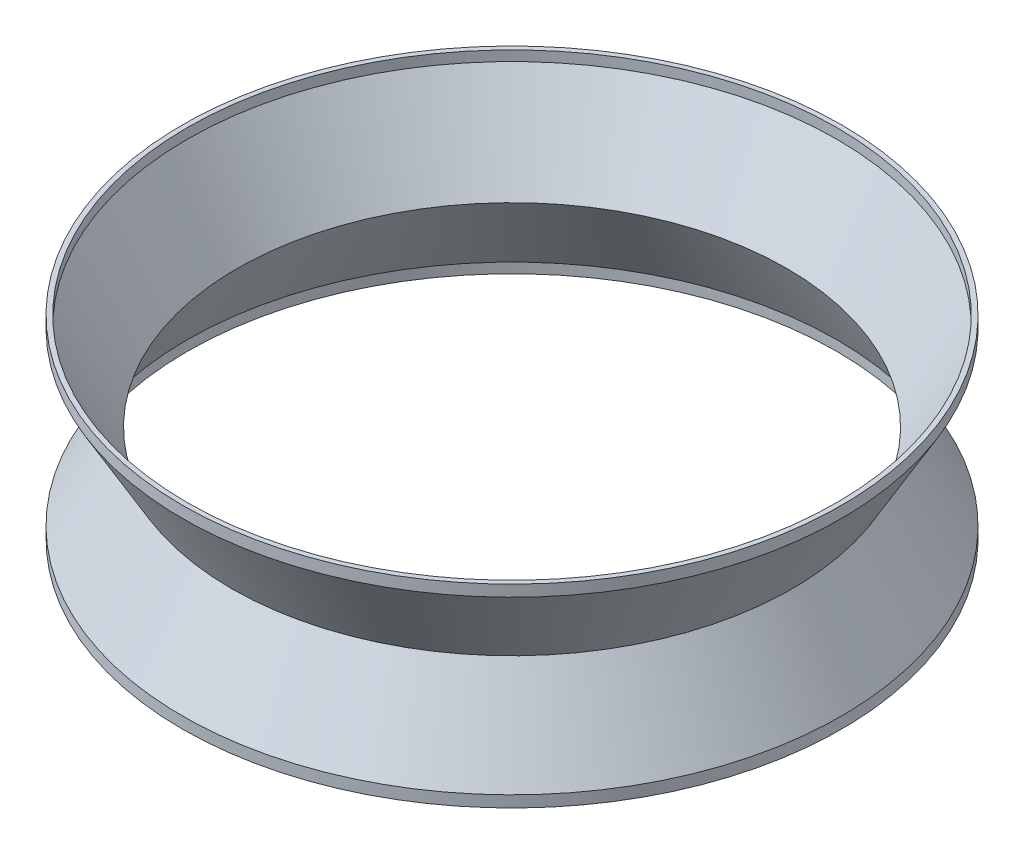
ISO-10303-21;
HEADER;
FILE_DESCRIPTION(('STEP AP214'),'2;1');
FILE_NAME('part.step','',(''),(''),'','','');
FILE_SCHEMA(('AUTOMOTIVE_DESIGN { 1 0 10303 214 1 1 1 1 }'));
ENDSEC;
DATA;
#1=APPLICATION_CONTEXT('core data for automotive mechanical design processes');
#2=APPLICATION_PROTOCOL_DEFINITION('international standard','automotive_design',2000,#1);
#3=PRODUCT_CONTEXT('',#1,'mechanical');
#4=PRODUCT('Part','Part','',(#3));
#5=PRODUCT_RELATED_PRODUCT_CATEGORY('part','',(#4));
#6=PRODUCT_DEFINITION_FORMATION('','',#4);
#7=PRODUCT_DEFINITION_CONTEXT('part definition',#1,'design');
#8=PRODUCT_DEFINITION('design','',#6,#7);
#9=PRODUCT_DEFINITION_SHAPE('','',#8);
#10=(LENGTH_UNIT() NAMED_UNIT(*) SI_UNIT(.MILLI.,.METRE.));
#11=(NAMED_UNIT(*) PLANE_ANGLE_UNIT() SI_UNIT($,.RADIAN.));
#12=(NAMED_UNIT(*) SI_UNIT($,.STERADIAN.) SOLID_ANGLE_UNIT());
#13=UNCERTAINTY_MEASURE_WITH_UNIT(LENGTH_MEASURE(1.E-05),#10,'distance_accuracy_value','');
#14=(GEOMETRIC_REPRESENTATION_CONTEXT(3) GLOBAL_UNCERTAINTY_ASSIGNED_CONTEXT((#13)) GLOBAL_UNIT_ASSIGNED_CONTEXT((#10,
#11,#12)) REPRESENTATION_CONTEXT('',''));
#15=CARTESIAN_POINT('',(0.,0.,0.));
#16=DIRECTION('',(0.,0.,1.));
#17=DIRECTION('',(1.,0.,0.));
#18=AXIS2_PLACEMENT_3D('',#15,#16,#17);
#19=CARTESIAN_POINT('',(0.,1.2,0.));
#20=DIRECTION('',(0.,-1.,0.));
#21=DIRECTION('',(0.,0.,-1.));
#22=AXIS2_PLACEMENT_3D('',#19,#20,#21);
#23=CYLINDRICAL_SURFACE('',#22,34.670752002315);
#24=CARTESIAN_POINT('',(0.,1.2,0.));
#25=DIRECTION('',(0.,-1.,0.));
#26=DIRECTION('',(0.,0.,-1.));
#27=AXIS2_PLACEMENT_3D('',#24,#25,#26);
#28=CIRCLE('',#27,34.670752002315);
#29=CARTESIAN_POINT('',(0.,1.2,-34.670752002315));
#30=VERTEX_POINT('',#29);
#31=EDGE_CURVE('E11',#30,#30,#28,.F.);
#32=ORIENTED_EDGE('',*,*,#31,.F.);
#33=EDGE_LOOP('',(#32));
#34=FACE_BOUND('',#33,.T.);
#35=CARTESIAN_POINT('',(0.,0.,0.));
#36=DIRECTION('',(0.,1.,0.));
#37=DIRECTION('',(0.,0.,1.));
#38=AXIS2_PLACEMENT_3D('',#35,#36,#37);
#39=CIRCLE('',#38,34.670752002315);
#40=CARTESIAN_POINT('',(0.,0.,34.670752002315));
#41=VERTEX_POINT('',#40);
#42=EDGE_CURVE('E53',#41,#41,#39,.T.);
#43=ORIENTED_EDGE('',*,*,#42,.T.);
#44=EDGE_LOOP('',(#43));
#45=FACE_BOUND('',#44,.T.);
#46=ADVANCED_FACE('F45',(#34,#45),#23,.T.);
#47=CARTESIAN_POINT('',(0.,0.,0.));
#48=DIRECTION('',(0.,1.,0.));
#49=DIRECTION('',(0.,0.,1.));
#50=AXIS2_PLACEMENT_3D('',#47,#48,#49);
#51=PLANE('',#50);
#52=CARTESIAN_POINT('',(0.,0.,0.));
#53=DIRECTION('',(0.,1.,0.));
#54=DIRECTION('',(0.,0.,1.));
#55=AXIS2_PLACEMENT_3D('',#52,#53,#54);
#56=CIRCLE('',#55,34.170752002315);
#57=CARTESIAN_POINT('',(0.,0.,34.170752002315));
#58=VERTEX_POINT('',#57);
#59=EDGE_CURVE('E94',#58,#58,#56,.T.);
#60=ORIENTED_EDGE('',*,*,#59,.T.);
#61=EDGE_LOOP('',(#60));
#62=FACE_BOUND('',#61,.T.);
#63=ORIENTED_EDGE('',*,*,#42,.F.);
#64=EDGE_LOOP('',(#63));
#65=FACE_BOUND('',#64,.T.);
#66=ADVANCED_FACE('F83',(#62,#65),#51,.F.);
#67=CARTESIAN_POINT('',(0.,10.2,0.));
#68=DIRECTION('',(0.,-1.,0.));
#69=DIRECTION('',(0.,0.,-1.));
#70=AXIS2_PLACEMENT_3D('',#67,#68,#69);
#71=CONICAL_SURFACE('',#70,29.4832013797942,0.522881662258581);
#72=ORIENTED_EDGE('',*,*,#31,.T.);
#73=EDGE_LOOP('',(#72));
#74=FACE_BOUND('',#73,.T.);
#75=CARTESIAN_POINT('',(0.,10.2,0.));
#76=DIRECTION('',(0.,1.,0.));
#77=DIRECTION('',(0.,0.,1.));
#78=AXIS2_PLACEMENT_3D('',#75,#76,#77);
#79=CIRCLE('',#78,29.4832013797942);
#80=CARTESIAN_POINT('',(0.,10.2,29.4832013797942));
#81=VERTEX_POINT('',#80);
#82=EDGE_CURVE('E58',#81,#81,#79,.T.);
#83=ORIENTED_EDGE('',*,*,#82,.F.);
#84=EDGE_LOOP('',(#83));
#85=FACE_BOUND('',#84,.T.);
#86=ADVANCED_FACE('F73',(#74,#85),#71,.T.);
#87=CARTESIAN_POINT('',(0.,19.2,0.));
#88=DIRECTION('',(0.,1.,0.));
#89=DIRECTION('',(0.,0.,-1.));
#90=AXIS2_PLACEMENT_3D('',#87,#88,#89);
#91=CYLINDRICAL_SURFACE('',#90,34.670752002315);
#92=CARTESIAN_POINT('',(0.,19.2,0.));
#93=DIRECTION('',(0.,-1.,0.));
#94=DIRECTION('',(0.,0.,-1.));
#95=AXIS2_PLACEMENT_3D('',#92,#93,#94);
#96=CIRCLE('',#95,34.670752002315);
#97=CARTESIAN_POINT('',(0.,19.2,-34.670752002315));
#98=VERTEX_POINT('',#97);
#99=EDGE_CURVE('E66',#98,#98,#96,.F.);
#100=ORIENTED_EDGE('',*,*,#99,.T.);
#101=EDGE_LOOP('',(#100));
#102=FACE_BOUND('',#101,.T.);
#103=CARTESIAN_POINT('',(0.,20.4,0.));
#104=DIRECTION('',(0.,1.,0.));
#105=DIRECTION('',(0.,0.,1.));
#106=AXIS2_PLACEMENT_3D('',#103,#104,#105);
#107=CIRCLE('',#106,34.670752002315);
#108=CARTESIAN_POINT('',(0.,20.4,34.670752002315));
#109=VERTEX_POINT('',#108);
#110=EDGE_CURVE('E105',#109,#109,#107,.T.);
#111=ORIENTED_EDGE('',*,*,#110,.F.);
#112=EDGE_LOOP('',(#111));
#113=FACE_BOUND('',#112,.T.);
#114=ADVANCED_FACE('F82',(#102,#113),#91,.T.);
#115=CARTESIAN_POINT('',(0.,20.4,0.));
#116=DIRECTION('',(0.,-1.,0.));
#117=DIRECTION('',(0.,0.,1.));
#118=AXIS2_PLACEMENT_3D('',#115,#116,#117);
#119=PLANE('',#118);
#120=CARTESIAN_POINT('',(0.,20.4,0.));
#121=DIRECTION('',(0.,-1.,0.));
#122=DIRECTION('',(0.,0.,-1.));
#123=AXIS2_PLACEMENT_3D('',#120,#121,#122);
#124=CIRCLE('',#123,34.170752002315);
#125=CARTESIAN_POINT('',(0.,20.4,-34.170752002315));
#126=VERTEX_POINT('',#125);
#127=EDGE_CURVE('E112',#126,#126,#124,.F.);
#128=ORIENTED_EDGE('',*,*,#127,.F.);
#129=EDGE_LOOP('',(#128));
#130=FACE_BOUND('',#129,.T.);
#131=ORIENTED_EDGE('',*,*,#110,.T.);
#132=EDGE_LOOP('',(#131));
#133=FACE_BOUND('',#132,.T.);
#134=ADVANCED_FACE('F133',(#130,#133),#119,.F.);
#135=CARTESIAN_POINT('',(0.,10.2,0.));
#136=DIRECTION('',(0.,1.,0.));
#137=DIRECTION('',(0.,0.,-1.));
#138=AXIS2_PLACEMENT_3D('',#135,#136,#137);
#139=CONICAL_SURFACE('',#138,29.4832013797942,0.522881662258581);
#140=ORIENTED_EDGE('',*,*,#99,.F.);
#141=EDGE_LOOP('',(#140));
#142=FACE_BOUND('',#141,.T.);
#143=ORIENTED_EDGE('',*,*,#82,.T.);
#144=EDGE_LOOP('',(#143));
#145=FACE_BOUND('',#144,.T.);
#146=ADVANCED_FACE('F123',(#142,#145),#139,.T.);
#147=CARTESIAN_POINT('',(0.,1.2,0.));
#148=DIRECTION('',(0.,-1.,0.));
#149=DIRECTION('',(0.,0.,-1.));
#150=AXIS2_PLACEMENT_3D('',#147,#148,#149);
#151=CYLINDRICAL_SURFACE('',#150,34.170752002315);
#152=CARTESIAN_POINT('',(0.,1.06621753527391,0.));
#153=DIRECTION('',(0.,-1.,0.));
#154=DIRECTION('',(0.,0.,-1.));
#155=AXIS2_PLACEMENT_3D('',#152,#153,#154);
#156=CIRCLE('',#155,34.170752002315);
#157=CARTESIAN_POINT('',(0.,1.06621753527391,-34.170752002315));
#158=VERTEX_POINT('',#157);
#159=EDGE_CURVE('E99',#158,#158,#156,.F.);
#160=ORIENTED_EDGE('',*,*,#159,.T.);
#161=EDGE_LOOP('',(#160));
#162=FACE_BOUND('',#161,.T.);
#163=ORIENTED_EDGE('',*,*,#59,.F.);
#164=EDGE_LOOP('',(#163));
#165=FACE_BOUND('',#164,.T.);
#166=ADVANCED_FACE('F132',(#162,#165),#151,.F.);
#167=CARTESIAN_POINT('',(0.,9.95031058343962,0.));
#168=DIRECTION('',(0.,-1.,0.));
#169=DIRECTION('',(0.,0.,-1.));
#170=AXIS2_PLACEMENT_3D('',#167,#168,#169);
#171=CONICAL_SURFACE('',#170,29.0500095109211,0.522881662258581);
#172=ORIENTED_EDGE('',*,*,#159,.F.);
#173=EDGE_LOOP('',(#172));
#174=FACE_BOUND('',#173,.T.);
#175=CARTESIAN_POINT('',(0.,10.2,0.));
#176=DIRECTION('',(0.,1.,0.));
#177=DIRECTION('',(0.,0.,1.));
#178=AXIS2_PLACEMENT_3D('',#175,#176,#177);
#179=CIRCLE('',#178,28.9060899011084);
#180=CARTESIAN_POINT('',(0.,10.2,28.9060899011084));
#181=VERTEX_POINT('',#180);
#182=EDGE_CURVE('E100',#181,#181,#179,.T.);
#183=ORIENTED_EDGE('',*,*,#182,.T.);
#184=EDGE_LOOP('',(#183));
#185=FACE_BOUND('',#184,.T.);
#186=ADVANCED_FACE('F156',(#174,#185),#171,.F.);
#187=CARTESIAN_POINT('',(0.,19.2,0.));
#188=DIRECTION('',(0.,1.,0.));
#189=DIRECTION('',(0.,0.,-1.));
#190=AXIS2_PLACEMENT_3D('',#187,#188,#189);
#191=CYLINDRICAL_SURFACE('',#190,34.170752002315);
#192=CARTESIAN_POINT('',(0.,19.3337824647261,0.));
#193=DIRECTION('',(0.,1.,0.));
#194=DIRECTION('',(0.,0.,1.));
#195=AXIS2_PLACEMENT_3D('',#192,#193,#194);
#196=CIRCLE('',#195,34.170752002315);
#197=CARTESIAN_POINT('',(0.,19.3337824647261,34.170752002315));
#198=VERTEX_POINT('',#197);
#199=EDGE_CURVE('E108',#198,#198,#196,.T.);
#200=ORIENTED_EDGE('',*,*,#199,.F.);
#201=EDGE_LOOP('',(#200));
#202=FACE_BOUND('',#201,.T.);
#203=ORIENTED_EDGE('',*,*,#127,.T.);
#204=EDGE_LOOP('',(#203));
#205=FACE_BOUND('',#204,.T.);
#206=ADVANCED_FACE('F154',(#202,#205),#191,.F.);
#207=CARTESIAN_POINT('',(0.,10.4496894165604,0.));
#208=DIRECTION('',(0.,1.,0.));
#209=DIRECTION('',(0.,0.,-1.));
#210=AXIS2_PLACEMENT_3D('',#207,#208,#209);
#211=CONICAL_SURFACE('',#210,29.0500095109211,0.522881662258581);
#212=ORIENTED_EDGE('',*,*,#199,.T.);
#213=EDGE_LOOP('',(#212));
#214=FACE_BOUND('',#213,.T.);
#215=ORIENTED_EDGE('',*,*,#182,.F.);
#216=EDGE_LOOP('',(#215));
#217=FACE_BOUND('',#216,.T.);
#218=ADVANCED_FACE('F135',(#214,#217),#211,.F.);
#219=CLOSED_SHELL('',(#46,#66,#86,#114,#134,#146,#166,#186,#206,#218));
#220=MANIFOLD_SOLID_BREP('B2',#219);
#221=ADVANCED_BREP_SHAPE_REPRESENTATION('',(#18,#220),#14);
#222=SHAPE_DEFINITION_REPRESENTATION(#9,#221);
ENDSEC;
END-ISO-10303-21;
